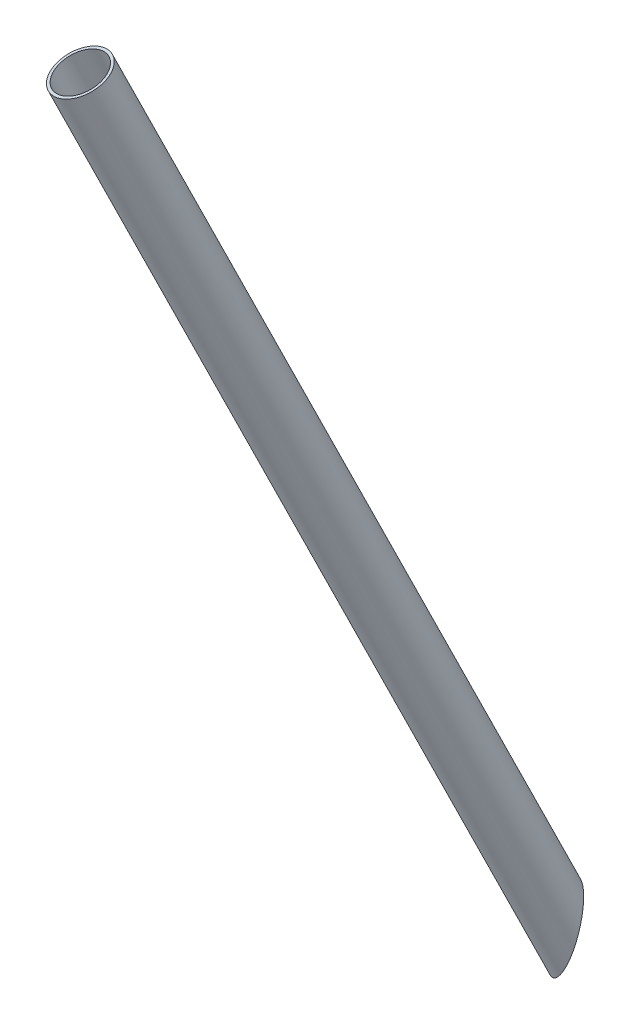
ISO-10303-21;
HEADER;
FILE_DESCRIPTION(('STEP AP214'),'2;1');
FILE_NAME('part.step','',(''),(''),'','','');
FILE_SCHEMA(('AUTOMOTIVE_DESIGN { 1 0 10303 214 1 1 1 1 }'));
ENDSEC;
DATA;
#1=APPLICATION_CONTEXT('core data for automotive mechanical design processes');
#2=APPLICATION_PROTOCOL_DEFINITION('international standard','automotive_design',2000,#1);
#3=PRODUCT_CONTEXT('',#1,'mechanical');
#4=PRODUCT('Part','Part','',(#3));
#5=PRODUCT_RELATED_PRODUCT_CATEGORY('part','',(#4));
#6=PRODUCT_DEFINITION_FORMATION('','',#4);
#7=PRODUCT_DEFINITION_CONTEXT('part definition',#1,'design');
#8=PRODUCT_DEFINITION('design','',#6,#7);
#9=PRODUCT_DEFINITION_SHAPE('','',#8);
#10=(LENGTH_UNIT() NAMED_UNIT(*) SI_UNIT(.MILLI.,.METRE.));
#11=(NAMED_UNIT(*) PLANE_ANGLE_UNIT() SI_UNIT($,.RADIAN.));
#12=(NAMED_UNIT(*) SI_UNIT($,.STERADIAN.) SOLID_ANGLE_UNIT());
#13=UNCERTAINTY_MEASURE_WITH_UNIT(LENGTH_MEASURE(1.E-05),#10,'distance_accuracy_value','');
#14=(GEOMETRIC_REPRESENTATION_CONTEXT(3) GLOBAL_UNCERTAINTY_ASSIGNED_CONTEXT((#13)) GLOBAL_UNIT_ASSIGNED_CONTEXT((#10,
#11,#12)) REPRESENTATION_CONTEXT('',''));
#15=CARTESIAN_POINT('',(0.,0.,0.));
#16=DIRECTION('',(0.,0.,1.));
#17=DIRECTION('',(1.,0.,0.));
#18=AXIS2_PLACEMENT_3D('',#15,#16,#17);
#19=CARTESIAN_POINT('',(-250.,0.,-1700.));
#20=DIRECTION('',(-0.214351342090107,0.914565726251124,0.342962147344171));
#21=DIRECTION('',(0.,-0.351123441588391,0.936329177569045));
#22=AXIS2_PLACEMENT_3D('',#19,#20,#21);
#23=CYLINDRICAL_SURFACE('',#22,9.79999999999998);
#24=CARTESIAN_POINT('',(-325.,320.,-1580.));
#25=DIRECTION('',(0.214351342090107,-0.914565726251124,-0.342962147344171));
#26=DIRECTION('',(0.620647271384696,-0.143596582877078,0.770828765620976));
#27=AXIS2_PLACEMENT_3D('',#24,#25,#26);
#28=CIRCLE('',#27,9.79999999999998);
#29=CARTESIAN_POINT('',(-318.91765674043,318.592753487805,-1572.44587809691));
#30=VERTEX_POINT('',#29);
#31=EDGE_CURVE('E47',#30,#30,#28,.T.);
#32=ORIENTED_EDGE('',*,*,#31,.F.);
#33=EDGE_LOOP('',(#32));
#34=FACE_BOUND('',#33,.T.);
#35=CARTESIAN_POINT('',(-246.393439859568,-15.3879899325124,-1705.77049622469));
#36=DIRECTION('',(0.490298311522791,-0.291983203687868,-0.821190218208954));
#37=DIRECTION('',(0.140336447675245,0.956366902675757,-0.25625773923976));
#38=AXIS2_PLACEMENT_3D('',#35,#36,#37);
#39=ELLIPSE('',#38,14.9899561378583,9.79999999999998);
#40=CARTESIAN_POINT('',(-244.289802664373,-1.05209200970342,-1709.61178849588));
#41=VERTEX_POINT('',#40);
#42=EDGE_CURVE('E43',#41,#41,#39,.T.);
#43=ORIENTED_EDGE('',*,*,#42,.T.);
#44=EDGE_LOOP('',(#43));
#45=FACE_BOUND('',#44,.T.);
#46=ADVANCED_FACE('F39',(#34,#45),#23,.F.);
#47=CARTESIAN_POINT('',(-250.,0.,-1700.));
#48=DIRECTION('',(-0.214351342090107,0.914565726251124,0.342962147344171));
#49=DIRECTION('',(0.,-0.351123441588391,0.936329177569045));
#50=AXIS2_PLACEMENT_3D('',#47,#48,#49);
#51=CYLINDRICAL_SURFACE('',#50,11.);
#52=CARTESIAN_POINT('',(-325.,320.,-1580.));
#53=DIRECTION('',(0.214351342090107,-0.914565726251124,-0.342962147344171));
#54=DIRECTION('',(0.620647271384696,-0.143596582877078,0.770828765620976));
#55=AXIS2_PLACEMENT_3D('',#52,#53,#54);
#56=CIRCLE('',#55,11.);
#57=CARTESIAN_POINT('',(-318.172880014769,318.420437588352,-1571.52088357817));
#58=VERTEX_POINT('',#57);
#59=EDGE_CURVE('E51',#58,#58,#56,.T.);
#60=ORIENTED_EDGE('',*,*,#59,.T.);
#61=EDGE_LOOP('',(#60));
#62=FACE_BOUND('',#61,.T.);
#63=CARTESIAN_POINT('',(-246.393439859568,-15.3879899325124,-1705.77049622469));
#64=DIRECTION('',(0.490298311522791,-0.291983203687868,-0.821190218208954));
#65=DIRECTION('',(0.140336447675245,0.956366902675757,-0.25625773923976));
#66=AXIS2_PLACEMENT_3D('',#63,#64,#65);
#67=ELLIPSE('',#66,16.8254609710654,11.);
#68=CARTESIAN_POINT('',(-244.03221443639,0.703324062477301,-1710.0821508148));
#69=VERTEX_POINT('',#68);
#70=EDGE_CURVE('E10',#69,#69,#67,.T.);
#71=ORIENTED_EDGE('',*,*,#70,.F.);
#72=EDGE_LOOP('',(#71));
#73=FACE_BOUND('',#72,.T.);
#74=ADVANCED_FACE('F67',(#62,#73),#51,.T.);
#75=CARTESIAN_POINT('',(-325.,320.,-1580.));
#76=DIRECTION('',(0.214351342090107,-0.914565726251124,-0.342962147344171));
#77=DIRECTION('',(0.620647271384696,-0.143596582877078,0.770828765620976));
#78=AXIS2_PLACEMENT_3D('',#75,#76,#77);
#79=PLANE('',#78);
#80=ORIENTED_EDGE('',*,*,#31,.T.);
#81=EDGE_LOOP('',(#80));
#82=FACE_BOUND('',#81,.T.);
#83=ORIENTED_EDGE('',*,*,#59,.F.);
#84=EDGE_LOOP('',(#83));
#85=FACE_BOUND('',#84,.T.);
#86=ADVANCED_FACE('F62',(#82,#85),#79,.F.);
#87=CARTESIAN_POINT('',(-235.144715460389,-3.09741723404358,-1703.42440180549));
#88=DIRECTION('',(0.490298311522791,-0.291983203687868,-0.821190218208954));
#89=DIRECTION('',(-0.858605277115103,0.,-0.512637277331737));
#90=AXIS2_PLACEMENT_3D('',#87,#88,#89);
#91=PLANE('',#90);
#92=ORIENTED_EDGE('',*,*,#42,.F.);
#93=EDGE_LOOP('',(#92));
#94=FACE_BOUND('',#93,.T.);
#95=ORIENTED_EDGE('',*,*,#70,.T.);
#96=EDGE_LOOP('',(#95));
#97=FACE_BOUND('',#96,.T.);
#98=ADVANCED_FACE('F41',(#94,#97),#91,.T.);
#99=CLOSED_SHELL('',(#46,#74,#86,#98));
#100=MANIFOLD_SOLID_BREP('B2',#99);
#101=ADVANCED_BREP_SHAPE_REPRESENTATION('',(#18,#100),#14);
#102=SHAPE_DEFINITION_REPRESENTATION(#9,#101);
ENDSEC;
END-ISO-10303-21;
